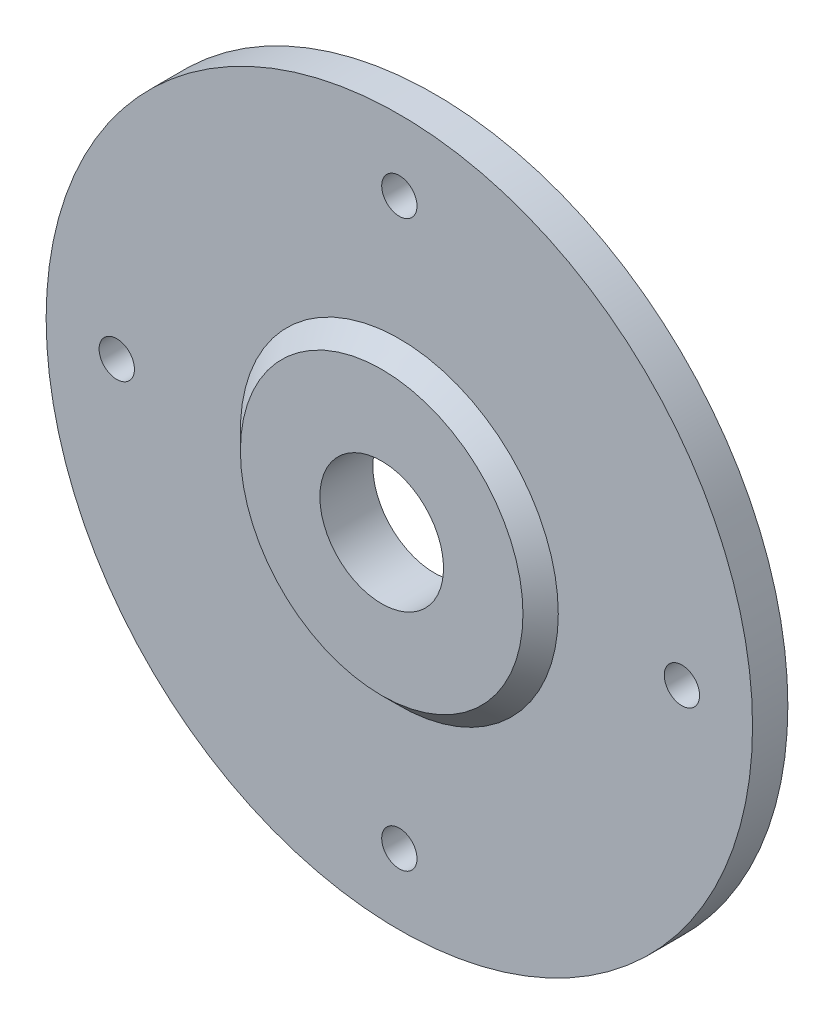
ISO-10303-21;
HEADER;
FILE_DESCRIPTION(('STEP AP214'),'2;1');
FILE_NAME('part.step','',(''),(''),'','','');
FILE_SCHEMA(('AUTOMOTIVE_DESIGN { 1 0 10303 214 1 1 1 1 }'));
ENDSEC;
DATA;
#1=APPLICATION_CONTEXT('core data for automotive mechanical design processes');
#2=APPLICATION_PROTOCOL_DEFINITION('international standard','automotive_design',2000,#1);
#3=PRODUCT_CONTEXT('',#1,'mechanical');
#4=PRODUCT('Part','Part','',(#3));
#5=PRODUCT_RELATED_PRODUCT_CATEGORY('part','',(#4));
#6=PRODUCT_DEFINITION_FORMATION('','',#4);
#7=PRODUCT_DEFINITION_CONTEXT('part definition',#1,'design');
#8=PRODUCT_DEFINITION('design','',#6,#7);
#9=PRODUCT_DEFINITION_SHAPE('','',#8);
#10=(LENGTH_UNIT() NAMED_UNIT(*) SI_UNIT(.MILLI.,.METRE.));
#11=(NAMED_UNIT(*) PLANE_ANGLE_UNIT() SI_UNIT($,.RADIAN.));
#12=(NAMED_UNIT(*) SI_UNIT($,.STERADIAN.) SOLID_ANGLE_UNIT());
#13=UNCERTAINTY_MEASURE_WITH_UNIT(LENGTH_MEASURE(1.E-05),#10,'distance_accuracy_value','');
#14=(GEOMETRIC_REPRESENTATION_CONTEXT(3) GLOBAL_UNCERTAINTY_ASSIGNED_CONTEXT((#13)) GLOBAL_UNIT_ASSIGNED_CONTEXT((#10,
#11,#12)) REPRESENTATION_CONTEXT('',''));
#15=CARTESIAN_POINT('',(0.,0.,0.));
#16=DIRECTION('',(0.,0.,1.));
#17=DIRECTION('',(1.,0.,0.));
#18=AXIS2_PLACEMENT_3D('',#15,#16,#17);
#19=CARTESIAN_POINT('',(0.,0.,1.));
#20=DIRECTION('',(0.,0.,-1.));
#21=DIRECTION('',(-1.,0.,0.));
#22=AXIS2_PLACEMENT_3D('',#19,#20,#21);
#23=CYLINDRICAL_SURFACE('',#22,10.);
#24=CARTESIAN_POINT('',(0.,0.,1.));
#25=DIRECTION('',(0.,0.,1.));
#26=DIRECTION('',(1.,0.,0.));
#27=AXIS2_PLACEMENT_3D('',#24,#25,#26);
#28=CIRCLE('',#27,10.);
#29=CARTESIAN_POINT('',(10.,0.,1.));
#30=VERTEX_POINT('',#29);
#31=EDGE_CURVE('E39',#30,#30,#28,.T.);
#32=ORIENTED_EDGE('',*,*,#31,.F.);
#33=EDGE_LOOP('',(#32));
#34=FACE_BOUND('',#33,.T.);
#35=CARTESIAN_POINT('',(0.,0.,0.));
#36=DIRECTION('',(0.,0.,1.));
#37=DIRECTION('',(1.,0.,0.));
#38=AXIS2_PLACEMENT_3D('',#35,#36,#37);
#39=CIRCLE('',#38,10.);
#40=CARTESIAN_POINT('',(10.,0.,0.));
#41=VERTEX_POINT('',#40);
#42=EDGE_CURVE('E43',#41,#41,#39,.T.);
#43=ORIENTED_EDGE('',*,*,#42,.T.);
#44=EDGE_LOOP('',(#43));
#45=FACE_BOUND('',#44,.T.);
#46=ADVANCED_FACE('F32',(#34,#45),#23,.T.);
#47=CARTESIAN_POINT('',(0.,0.,1.));
#48=DIRECTION('',(0.,0.,1.));
#49=DIRECTION('',(1.,0.,0.));
#50=AXIS2_PLACEMENT_3D('',#47,#48,#49);
#51=PLANE('',#50);
#52=CARTESIAN_POINT('',(-8.00000000000023,2.26393958003914E-13,1.));
#53=DIRECTION('',(0.,0.,1.));
#54=DIRECTION('',(1.,0.,0.));
#55=AXIS2_PLACEMENT_3D('',#52,#53,#54);
#56=CIRCLE('',#55,0.500000000000178);
#57=CARTESIAN_POINT('',(-7.50000000000005,2.26393958003914E-13,1.));
#58=VERTEX_POINT('',#57);
#59=EDGE_CURVE('E64',#58,#58,#56,.T.);
#60=ORIENTED_EDGE('',*,*,#59,.F.);
#61=EDGE_LOOP('',(#60));
#62=FACE_BOUND('',#61,.T.);
#63=CARTESIAN_POINT('',(-4.52787916007828E-13,-8.,1.));
#64=DIRECTION('',(0.,0.,1.));
#65=DIRECTION('',(1.,0.,0.));
#66=AXIS2_PLACEMENT_3D('',#63,#64,#65);
#67=CIRCLE('',#66,0.500000000000487);
#68=CARTESIAN_POINT('',(0.500000000000034,-8.,1.));
#69=VERTEX_POINT('',#68);
#70=EDGE_CURVE('E67',#69,#69,#67,.T.);
#71=ORIENTED_EDGE('',*,*,#70,.F.);
#72=EDGE_LOOP('',(#71));
#73=FACE_BOUND('',#72,.T.);
#74=CARTESIAN_POINT('',(7.99999999999977,-2.27373675443232E-13,1.));
#75=DIRECTION('',(0.,0.,1.));
#76=DIRECTION('',(1.,0.,0.));
#77=AXIS2_PLACEMENT_3D('',#74,#75,#76);
#78=CIRCLE('',#77,0.500000000000363);
#79=CARTESIAN_POINT('',(8.50000000000014,-2.27373675443232E-13,1.));
#80=VERTEX_POINT('',#79);
#81=EDGE_CURVE('E70',#80,#80,#78,.T.);
#82=ORIENTED_EDGE('',*,*,#81,.F.);
#83=EDGE_LOOP('',(#82));
#84=FACE_BOUND('',#83,.T.);
#85=CARTESIAN_POINT('',(0.,8.,1.));
#86=DIRECTION('',(0.,0.,1.));
#87=DIRECTION('',(1.,0.,0.));
#88=AXIS2_PLACEMENT_3D('',#85,#86,#87);
#89=CIRCLE('',#88,0.5);
#90=CARTESIAN_POINT('',(0.5,8.,1.));
#91=VERTEX_POINT('',#90);
#92=EDGE_CURVE('E56',#91,#91,#89,.T.);
#93=ORIENTED_EDGE('',*,*,#92,.F.);
#94=EDGE_LOOP('',(#93));
#95=FACE_BOUND('',#94,.T.);
#96=CARTESIAN_POINT('',(0.,0.,1.));
#97=DIRECTION('',(0.,0.,1.));
#98=DIRECTION('',(1.,0.,0.));
#99=AXIS2_PLACEMENT_3D('',#96,#97,#98);
#100=CIRCLE('',#99,4.5);
#101=CARTESIAN_POINT('',(4.5,0.,1.));
#102=VERTEX_POINT('',#101);
#103=EDGE_CURVE('E48',#102,#102,#100,.T.);
#104=ORIENTED_EDGE('',*,*,#103,.F.);
#105=EDGE_LOOP('',(#104));
#106=FACE_BOUND('',#105,.T.);
#107=ORIENTED_EDGE('',*,*,#31,.T.);
#108=EDGE_LOOP('',(#107));
#109=FACE_BOUND('',#108,.T.);
#110=ADVANCED_FACE('F89',(#62,#73,#84,#95,#106,#109),#51,.T.);
#111=CARTESIAN_POINT('',(0.,0.,0.));
#112=DIRECTION('',(0.,0.,1.));
#113=DIRECTION('',(1.,0.,0.));
#114=AXIS2_PLACEMENT_3D('',#111,#112,#113);
#115=PLANE('',#114);
#116=CARTESIAN_POINT('',(-8.00000000000023,2.26393958003914E-13,0.));
#117=DIRECTION('',(0.,0.,-1.));
#118=DIRECTION('',(-1.,0.,0.));
#119=AXIS2_PLACEMENT_3D('',#116,#117,#118);
#120=CIRCLE('',#119,0.500000000000178);
#121=CARTESIAN_POINT('',(-8.5000000000004,2.26393958003914E-13,0.));
#122=VERTEX_POINT('',#121);
#123=EDGE_CURVE('E73',#122,#122,#120,.T.);
#124=ORIENTED_EDGE('',*,*,#123,.F.);
#125=EDGE_LOOP('',(#124));
#126=FACE_BOUND('',#125,.T.);
#127=CARTESIAN_POINT('',(-4.52787916007828E-13,-8.,0.));
#128=DIRECTION('',(0.,0.,-1.));
#129=DIRECTION('',(-1.,0.,0.));
#130=AXIS2_PLACEMENT_3D('',#127,#128,#129);
#131=CIRCLE('',#130,0.500000000000487);
#132=CARTESIAN_POINT('',(-0.500000000000939,-8.,0.));
#133=VERTEX_POINT('',#132);
#134=EDGE_CURVE('E77',#133,#133,#131,.T.);
#135=ORIENTED_EDGE('',*,*,#134,.F.);
#136=EDGE_LOOP('',(#135));
#137=FACE_BOUND('',#136,.T.);
#138=CARTESIAN_POINT('',(7.99999999999977,-2.27373675443232E-13,0.));
#139=DIRECTION('',(0.,0.,-1.));
#140=DIRECTION('',(-1.,0.,0.));
#141=AXIS2_PLACEMENT_3D('',#138,#139,#140);
#142=CIRCLE('',#141,0.500000000000363);
#143=CARTESIAN_POINT('',(7.49999999999941,-2.27373675443232E-13,0.));
#144=VERTEX_POINT('',#143);
#145=EDGE_CURVE('E74',#144,#144,#142,.T.);
#146=ORIENTED_EDGE('',*,*,#145,.F.);
#147=EDGE_LOOP('',(#146));
#148=FACE_BOUND('',#147,.T.);
#149=CARTESIAN_POINT('',(0.,8.,0.));
#150=DIRECTION('',(0.,0.,-1.));
#151=DIRECTION('',(-1.,0.,0.));
#152=AXIS2_PLACEMENT_3D('',#149,#150,#151);
#153=CIRCLE('',#152,0.5);
#154=CARTESIAN_POINT('',(-0.5,8.,0.));
#155=VERTEX_POINT('',#154);
#156=EDGE_CURVE('E61',#155,#155,#153,.T.);
#157=ORIENTED_EDGE('',*,*,#156,.F.);
#158=EDGE_LOOP('',(#157));
#159=FACE_BOUND('',#158,.T.);
#160=CARTESIAN_POINT('',(0.,0.,0.));
#161=DIRECTION('',(0.,0.,-1.));
#162=DIRECTION('',(-1.,0.,0.));
#163=AXIS2_PLACEMENT_3D('',#160,#161,#162);
#164=CIRCLE('',#163,1.75);
#165=CARTESIAN_POINT('',(-1.75,0.,0.));
#166=VERTEX_POINT('',#165);
#167=EDGE_CURVE('E53',#166,#166,#164,.T.);
#168=ORIENTED_EDGE('',*,*,#167,.F.);
#169=EDGE_LOOP('',(#168));
#170=FACE_BOUND('',#169,.T.);
#171=ORIENTED_EDGE('',*,*,#42,.F.);
#172=EDGE_LOOP('',(#171));
#173=FACE_BOUND('',#172,.T.);
#174=ADVANCED_FACE('F85',(#126,#137,#148,#159,#170,#173),#115,.F.);
#175=CARTESIAN_POINT('',(0.,0.,1.5));
#176=DIRECTION('',(0.,0.,1.));
#177=DIRECTION('',(1.,0.,0.));
#178=AXIS2_PLACEMENT_3D('',#175,#176,#177);
#179=PLANE('',#178);
#180=CARTESIAN_POINT('',(0.,0.,1.5));
#181=DIRECTION('',(0.,0.,-1.));
#182=DIRECTION('',(-1.,0.,0.));
#183=AXIS2_PLACEMENT_3D('',#180,#181,#182);
#184=CIRCLE('',#183,1.75);
#185=CARTESIAN_POINT('',(-1.75,0.,1.5));
#186=VERTEX_POINT('',#185);
#187=EDGE_CURVE('E52',#186,#186,#184,.T.);
#188=ORIENTED_EDGE('',*,*,#187,.T.);
#189=EDGE_LOOP('',(#188));
#190=FACE_BOUND('',#189,.T.);
#191=CARTESIAN_POINT('',(0.,0.,1.5));
#192=DIRECTION('',(0.,0.,1.));
#193=DIRECTION('',(1.,0.,0.));
#194=AXIS2_PLACEMENT_3D('',#191,#192,#193);
#195=CIRCLE('',#194,3.99999999999999);
#196=CARTESIAN_POINT('',(3.99999999999999,0.,1.5));
#197=VERTEX_POINT('',#196);
#198=EDGE_CURVE('E10',#197,#197,#195,.T.);
#199=ORIENTED_EDGE('',*,*,#198,.T.);
#200=EDGE_LOOP('',(#199));
#201=FACE_BOUND('',#200,.T.);
#202=ADVANCED_FACE('F88',(#190,#201),#179,.T.);
#203=CARTESIAN_POINT('',(0.,0.,1.5));
#204=DIRECTION('',(0.,0.,-1.));
#205=DIRECTION('',(-1.,0.,0.));
#206=AXIS2_PLACEMENT_3D('',#203,#204,#205);
#207=CONICAL_SURFACE('',#206,3.99999999999999,0.785398163397448);
#208=ORIENTED_EDGE('',*,*,#103,.T.);
#209=EDGE_LOOP('',(#208));
#210=FACE_BOUND('',#209,.T.);
#211=ORIENTED_EDGE('',*,*,#198,.F.);
#212=EDGE_LOOP('',(#211));
#213=FACE_BOUND('',#212,.T.);
#214=ADVANCED_FACE('F34',(#210,#213),#207,.T.);
#215=CARTESIAN_POINT('',(0.,0.,1.5));
#216=DIRECTION('',(0.,0.,-1.));
#217=DIRECTION('',(-1.,0.,0.));
#218=AXIS2_PLACEMENT_3D('',#215,#216,#217);
#219=CYLINDRICAL_SURFACE('',#218,1.75);
#220=ORIENTED_EDGE('',*,*,#187,.F.);
#221=EDGE_LOOP('',(#220));
#222=FACE_BOUND('',#221,.T.);
#223=ORIENTED_EDGE('',*,*,#167,.T.);
#224=EDGE_LOOP('',(#223));
#225=FACE_BOUND('',#224,.T.);
#226=ADVANCED_FACE('F112',(#222,#225),#219,.F.);
#227=CARTESIAN_POINT('',(0.,8.,1.5));
#228=DIRECTION('',(0.,0.,-1.));
#229=DIRECTION('',(-1.,0.,0.));
#230=AXIS2_PLACEMENT_3D('',#227,#228,#229);
#231=CYLINDRICAL_SURFACE('',#230,0.5);
#232=ORIENTED_EDGE('',*,*,#92,.T.);
#233=EDGE_LOOP('',(#232));
#234=FACE_BOUND('',#233,.T.);
#235=ORIENTED_EDGE('',*,*,#156,.T.);
#236=EDGE_LOOP('',(#235));
#237=FACE_BOUND('',#236,.T.);
#238=ADVANCED_FACE('F115',(#234,#237),#231,.F.);
#239=CARTESIAN_POINT('',(7.99999999999977,-2.27373675443232E-13,1.5));
#240=DIRECTION('',(0.,0.,-1.));
#241=DIRECTION('',(-1.,0.,0.));
#242=AXIS2_PLACEMENT_3D('',#239,#240,#241);
#243=CYLINDRICAL_SURFACE('',#242,0.500000000000363);
#244=ORIENTED_EDGE('',*,*,#81,.T.);
#245=EDGE_LOOP('',(#244));
#246=FACE_BOUND('',#245,.T.);
#247=ORIENTED_EDGE('',*,*,#145,.T.);
#248=EDGE_LOOP('',(#247));
#249=FACE_BOUND('',#248,.T.);
#250=ADVANCED_FACE('F119',(#246,#249),#243,.F.);
#251=CARTESIAN_POINT('',(-4.52787916007828E-13,-8.,1.5));
#252=DIRECTION('',(0.,0.,-1.));
#253=DIRECTION('',(-1.,0.,0.));
#254=AXIS2_PLACEMENT_3D('',#251,#252,#253);
#255=CYLINDRICAL_SURFACE('',#254,0.500000000000487);
#256=ORIENTED_EDGE('',*,*,#70,.T.);
#257=EDGE_LOOP('',(#256));
#258=FACE_BOUND('',#257,.T.);
#259=ORIENTED_EDGE('',*,*,#134,.T.);
#260=EDGE_LOOP('',(#259));
#261=FACE_BOUND('',#260,.T.);
#262=ADVANCED_FACE('F123',(#258,#261),#255,.F.);
#263=CARTESIAN_POINT('',(-8.00000000000023,2.26393958003914E-13,1.5));
#264=DIRECTION('',(0.,0.,-1.));
#265=DIRECTION('',(-1.,0.,0.));
#266=AXIS2_PLACEMENT_3D('',#263,#264,#265);
#267=CYLINDRICAL_SURFACE('',#266,0.500000000000178);
#268=ORIENTED_EDGE('',*,*,#59,.T.);
#269=EDGE_LOOP('',(#268));
#270=FACE_BOUND('',#269,.T.);
#271=ORIENTED_EDGE('',*,*,#123,.T.);
#272=EDGE_LOOP('',(#271));
#273=FACE_BOUND('',#272,.T.);
#274=ADVANCED_FACE('F83',(#270,#273),#267,.F.);
#275=CLOSED_SHELL('',(#46,#110,#174,#202,#214,#226,#238,#250,#262,#274));
#276=MANIFOLD_SOLID_BREP('B2',#275);
#277=ADVANCED_BREP_SHAPE_REPRESENTATION('',(#18,#276),#14);
#278=SHAPE_DEFINITION_REPRESENTATION(#9,#277);
ENDSEC;
END-ISO-10303-21;
